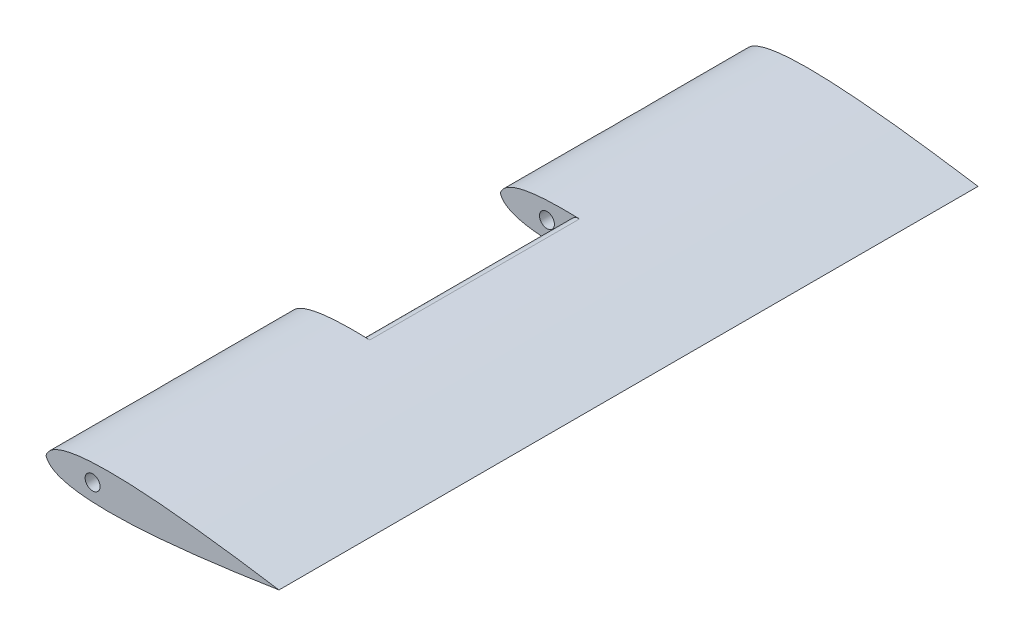
ISO-10303-21;
HEADER;
FILE_DESCRIPTION(('STEP AP214'),'2;1');
FILE_NAME('part.step','',(''),(''),'','','');
FILE_SCHEMA(('AUTOMOTIVE_DESIGN { 1 0 10303 214 1 1 1 1 }'));
ENDSEC;
DATA;
#1=APPLICATION_CONTEXT('core data for automotive mechanical design processes');
#2=APPLICATION_PROTOCOL_DEFINITION('international standard','automotive_design',2000,#1);
#3=PRODUCT_CONTEXT('',#1,'mechanical');
#4=PRODUCT('Part','Part','',(#3));
#5=PRODUCT_RELATED_PRODUCT_CATEGORY('part','',(#4));
#6=PRODUCT_DEFINITION_FORMATION('','',#4);
#7=PRODUCT_DEFINITION_CONTEXT('part definition',#1,'design');
#8=PRODUCT_DEFINITION('design','',#6,#7);
#9=PRODUCT_DEFINITION_SHAPE('','',#8);
#10=(LENGTH_UNIT() NAMED_UNIT(*) SI_UNIT(.MILLI.,.METRE.));
#11=(NAMED_UNIT(*) PLANE_ANGLE_UNIT() SI_UNIT($,.RADIAN.));
#12=(NAMED_UNIT(*) SI_UNIT($,.STERADIAN.) SOLID_ANGLE_UNIT());
#13=UNCERTAINTY_MEASURE_WITH_UNIT(LENGTH_MEASURE(1.E-05),#10,'distance_accuracy_value','');
#14=(GEOMETRIC_REPRESENTATION_CONTEXT(3) GLOBAL_UNCERTAINTY_ASSIGNED_CONTEXT((#13)) GLOBAL_UNIT_ASSIGNED_CONTEXT((#10,
#11,#12)) REPRESENTATION_CONTEXT('',''));
#15=CARTESIAN_POINT('',(0.,0.,0.));
#16=DIRECTION('',(0.,0.,1.));
#17=DIRECTION('',(1.,0.,0.));
#18=AXIS2_PLACEMENT_3D('',#15,#16,#17);
#19=CARTESIAN_POINT('',(-96.3888888888889,0.,75.));
#20=CARTESIAN_POINT('',(-94.2178519249729,7.51357712199036,75.));
#21=CARTESIAN_POINT('',(-46.3888888888889,0.,75.));
#22=B_SPLINE_CURVE_WITH_KNOTS('',2,(#19,#20,#21),.UNSPECIFIED.,.F.,.F.,(3,3),(0.,1.),.UNSPECIFIED.);
#23=DIRECTION('',(0.,0.,-1.));
#24=VECTOR('',#23,1.);
#25=SURFACE_OF_LINEAR_EXTRUSION('',#22,#24);
#26=DIRECTION('',(0.,0.,-1.));
#27=VECTOR('',#26,1.);
#28=CARTESIAN_POINT('',(-79.404655713445,3.69483376264788,-22.5));
#29=LINE('',#28,#27);
#30=CARTESIAN_POINT('',(-79.404655713445,3.69483376264787,-22.5));
#31=VERTEX_POINT('',#30);
#32=CARTESIAN_POINT('',(-79.404655713445,3.69483376264788,22.5));
#33=VERTEX_POINT('',#32);
#34=EDGE_CURVE('E115',#31,#33,#29,.F.);
#35=ORIENTED_EDGE('',*,*,#34,.T.);
#36=CARTESIAN_POINT('',(-96.3888888888889,0.,22.5));
#37=CARTESIAN_POINT('',(-94.2178519249729,7.51357712199036,22.5));
#38=CARTESIAN_POINT('',(-46.3888888888889,0.,22.5));
#39=B_SPLINE_CURVE_WITH_KNOTS('',2,(#36,#37,#38),.UNSPECIFIED.,.F.,.F.,(3,3),(0.,1.),.UNSPECIFIED.);
#40=CARTESIAN_POINT('',(-96.3888888888889,0.,22.5));
#41=VERTEX_POINT('',#40);
#42=EDGE_CURVE('E57',#33,#41,#39,.F.);
#43=ORIENTED_EDGE('',*,*,#42,.T.);
#44=DIRECTION('',(0.,0.,-1.));
#45=VECTOR('',#44,1.);
#46=CARTESIAN_POINT('',(-96.3888888888889,0.,75.));
#47=LINE('',#46,#45);
#48=CARTESIAN_POINT('',(-96.3888888888889,0.,75.));
#49=VERTEX_POINT('',#48);
#50=EDGE_CURVE('E112',#49,#41,#47,.T.);
#51=ORIENTED_EDGE('',*,*,#50,.F.);
#52=CARTESIAN_POINT('',(-46.3888888888889,0.,75.));
#53=VERTEX_POINT('',#52);
#54=EDGE_CURVE('E224',#49,#53,#22,.T.);
#55=ORIENTED_EDGE('',*,*,#54,.T.);
#56=DIRECTION('',(0.,0.,-1.));
#57=VECTOR('',#56,1.);
#58=CARTESIAN_POINT('',(-46.3888888888889,0.,75.));
#59=LINE('',#58,#57);
#60=CARTESIAN_POINT('',(-46.3888888888889,0.,-75.));
#61=VERTEX_POINT('',#60);
#62=EDGE_CURVE('E131',#53,#61,#59,.T.);
#63=ORIENTED_EDGE('',*,*,#62,.T.);
#64=CARTESIAN_POINT('',(-96.3888888888889,0.,-75.));
#65=CARTESIAN_POINT('',(-94.2178519249729,7.51357712199036,-75.));
#66=CARTESIAN_POINT('',(-46.3888888888889,0.,-75.));
#67=B_SPLINE_CURVE_WITH_KNOTS('',2,(#64,#65,#66),.UNSPECIFIED.,.F.,.F.,(3,3),(0.,1.),.UNSPECIFIED.);
#68=CARTESIAN_POINT('',(-96.3888888888889,0.,-75.));
#69=VERTEX_POINT('',#68);
#70=EDGE_CURVE('E202',#69,#61,#67,.T.);
#71=ORIENTED_EDGE('',*,*,#70,.F.);
#72=CARTESIAN_POINT('',(-96.3888888888889,0.,-22.5));
#73=VERTEX_POINT('',#72);
#74=EDGE_CURVE('E125',#73,#69,#47,.T.);
#75=ORIENTED_EDGE('',*,*,#74,.F.);
#76=CARTESIAN_POINT('',(-96.3888888888889,0.,-22.5));
#77=CARTESIAN_POINT('',(-94.2178519249729,7.51357712199036,-22.5));
#78=CARTESIAN_POINT('',(-46.3888888888889,0.,-22.5));
#79=B_SPLINE_CURVE_WITH_KNOTS('',2,(#76,#77,#78),.UNSPECIFIED.,.F.,.F.,(3,3),(0.,1.),.UNSPECIFIED.);
#80=EDGE_CURVE('E65',#31,#73,#79,.F.);
#81=ORIENTED_EDGE('',*,*,#80,.F.);
#82=EDGE_LOOP('',(#35,#43,#51,#55,#63,#71,#75,#81));
#83=FACE_BOUND('',#82,.T.);
#84=ADVANCED_FACE('F41',(#83),#25,.T.);
#85=CARTESIAN_POINT('',(-86.3888888888889,0.,75.));
#86=DIRECTION('',(0.,0.,-1.));
#87=DIRECTION('',(-1.,0.,0.));
#88=AXIS2_PLACEMENT_3D('',#85,#86,#87);
#89=CYLINDRICAL_SURFACE('',#88,1.60000000000001);
#90=CARTESIAN_POINT('',(-86.3888888888889,0.,75.));
#91=DIRECTION('',(0.,0.,1.));
#92=DIRECTION('',(1.,0.,0.));
#93=AXIS2_PLACEMENT_3D('',#90,#91,#92);
#94=CIRCLE('',#93,1.60000000000001);
#95=CARTESIAN_POINT('',(-84.7888888888889,0.,75.));
#96=VERTEX_POINT('',#95);
#97=EDGE_CURVE('E217',#96,#96,#94,.T.);
#98=ORIENTED_EDGE('',*,*,#97,.T.);
#99=EDGE_LOOP('',(#98));
#100=FACE_BOUND('',#99,.T.);
#101=CARTESIAN_POINT('',(-86.3888888888889,0.,22.5));
#102=DIRECTION('',(0.,0.,-1.));
#103=DIRECTION('',(-1.,0.,0.));
#104=AXIS2_PLACEMENT_3D('',#101,#102,#103);
#105=CIRCLE('',#104,1.60000000000001);
#106=CARTESIAN_POINT('',(-87.9888888888889,0.,22.5));
#107=VERTEX_POINT('',#106);
#108=EDGE_CURVE('E117',#107,#107,#105,.T.);
#109=ORIENTED_EDGE('',*,*,#108,.T.);
#110=EDGE_LOOP('',(#109));
#111=FACE_BOUND('',#110,.T.);
#112=ADVANCED_FACE('F239',(#100,#111),#89,.F.);
#113=CARTESIAN_POINT('',(-96.3888888888889,0.,75.));
#114=CARTESIAN_POINT('',(-94.2178519249729,-7.51357712199036,75.));
#115=CARTESIAN_POINT('',(-46.3888888888889,0.,75.));
#116=B_SPLINE_CURVE_WITH_KNOTS('',2,(#113,#114,#115),.UNSPECIFIED.,.F.,.F.,(3,3),(0.,1.),.UNSPECIFIED.);
#117=DIRECTION('',(0.,0.,-1.));
#118=VECTOR('',#117,1.);
#119=SURFACE_OF_LINEAR_EXTRUSION('',#116,#118);
#120=CARTESIAN_POINT('',(-96.3888888888889,0.,22.5));
#121=CARTESIAN_POINT('',(-94.2178519249729,-7.51357712199036,22.5));
#122=CARTESIAN_POINT('',(-46.3888888888889,0.,22.5));
#123=B_SPLINE_CURVE_WITH_KNOTS('',2,(#120,#121,#122),.UNSPECIFIED.,.F.,.F.,(3,3),(0.,1.),.UNSPECIFIED.);
#124=CARTESIAN_POINT('',(-79.404655713445,-3.69483376264788,22.5));
#125=VERTEX_POINT('',#124);
#126=EDGE_CURVE('E99',#125,#41,#123,.F.);
#127=ORIENTED_EDGE('',*,*,#126,.F.);
#128=DIRECTION('',(0.,0.,-1.));
#129=VECTOR('',#128,1.);
#130=CARTESIAN_POINT('',(-79.404655713445,-3.69483376264788,22.5));
#131=LINE('',#130,#129);
#132=CARTESIAN_POINT('',(-79.404655713445,-3.69483376264788,-22.5));
#133=VERTEX_POINT('',#132);
#134=EDGE_CURVE('E151',#125,#133,#131,.T.);
#135=ORIENTED_EDGE('',*,*,#134,.T.);
#136=CARTESIAN_POINT('',(-96.3888888888889,0.,-22.5));
#137=CARTESIAN_POINT('',(-94.2178519249729,-7.51357712199036,-22.5));
#138=CARTESIAN_POINT('',(-46.3888888888889,0.,-22.5));
#139=B_SPLINE_CURVE_WITH_KNOTS('',2,(#136,#137,#138),.UNSPECIFIED.,.F.,.F.,(3,3),(0.,1.),.UNSPECIFIED.);
#140=EDGE_CURVE('E109',#133,#73,#139,.F.);
#141=ORIENTED_EDGE('',*,*,#140,.T.);
#142=ORIENTED_EDGE('',*,*,#74,.T.);
#143=CARTESIAN_POINT('',(-96.3888888888889,0.,-75.));
#144=CARTESIAN_POINT('',(-94.2178519249729,-7.51357712199036,-75.));
#145=CARTESIAN_POINT('',(-46.3888888888889,0.,-75.));
#146=B_SPLINE_CURVE_WITH_KNOTS('',2,(#143,#144,#145),.UNSPECIFIED.,.F.,.F.,(3,3),(0.,1.),.UNSPECIFIED.);
#147=EDGE_CURVE('E208',#69,#61,#146,.T.);
#148=ORIENTED_EDGE('',*,*,#147,.T.);
#149=ORIENTED_EDGE('',*,*,#62,.F.);
#150=EDGE_CURVE('E122',#49,#53,#116,.T.);
#151=ORIENTED_EDGE('',*,*,#150,.F.);
#152=ORIENTED_EDGE('',*,*,#50,.T.);
#153=EDGE_LOOP('',(#127,#135,#141,#142,#148,#149,#151,#152));
#154=FACE_BOUND('',#153,.T.);
#155=ADVANCED_FACE('F120',(#154),#119,.F.);
#156=CARTESIAN_POINT('',(-86.3888888888889,0.,-22.5));
#157=DIRECTION('',(0.,0.,-1.));
#158=DIRECTION('',(-1.,0.,0.));
#159=AXIS2_PLACEMENT_3D('',#156,#157,#158);
#160=CIRCLE('',#159,1.60000000000001);
#161=CARTESIAN_POINT('',(-87.9888888888889,0.,-22.5));
#162=VERTEX_POINT('',#161);
#163=EDGE_CURVE('E118',#162,#162,#160,.T.);
#164=ORIENTED_EDGE('',*,*,#163,.F.);
#165=EDGE_LOOP('',(#164));
#166=FACE_BOUND('',#165,.T.);
#167=CARTESIAN_POINT('',(-86.3888888888889,0.,-75.));
#168=DIRECTION('',(0.,0.,1.));
#169=DIRECTION('',(1.,0.,0.));
#170=AXIS2_PLACEMENT_3D('',#167,#168,#169);
#171=CIRCLE('',#170,1.60000000000001);
#172=CARTESIAN_POINT('',(-84.7888888888889,0.,-75.));
#173=VERTEX_POINT('',#172);
#174=EDGE_CURVE('E198',#173,#173,#171,.T.);
#175=ORIENTED_EDGE('',*,*,#174,.F.);
#176=EDGE_LOOP('',(#175));
#177=FACE_BOUND('',#176,.T.);
#178=ADVANCED_FACE('F241',(#166,#177),#89,.F.);
#179=CARTESIAN_POINT('',(0.,0.,75.));
#180=DIRECTION('',(0.,0.,1.));
#181=DIRECTION('',(1.,0.,0.));
#182=AXIS2_PLACEMENT_3D('',#179,#180,#181);
#183=PLANE('',#182);
#184=ORIENTED_EDGE('',*,*,#97,.F.);
#185=EDGE_LOOP('',(#184));
#186=FACE_BOUND('',#185,.T.);
#187=ORIENTED_EDGE('',*,*,#54,.F.);
#188=ORIENTED_EDGE('',*,*,#150,.T.);
#189=EDGE_LOOP('',(#187,#188));
#190=FACE_BOUND('',#189,.T.);
#191=ADVANCED_FACE('F243',(#186,#190),#183,.T.);
#192=CARTESIAN_POINT('',(0.,0.,-75.));
#193=DIRECTION('',(0.,0.,1.));
#194=DIRECTION('',(1.,0.,0.));
#195=AXIS2_PLACEMENT_3D('',#192,#193,#194);
#196=PLANE('',#195);
#197=ORIENTED_EDGE('',*,*,#174,.T.);
#198=EDGE_LOOP('',(#197));
#199=FACE_BOUND('',#198,.T.);
#200=ORIENTED_EDGE('',*,*,#70,.T.);
#201=ORIENTED_EDGE('',*,*,#147,.F.);
#202=EDGE_LOOP('',(#200,#201));
#203=FACE_BOUND('',#202,.T.);
#204=ADVANCED_FACE('F257',(#199,#203),#196,.F.);
#205=CARTESIAN_POINT('',(0.,0.,22.5));
#206=DIRECTION('',(0.,0.,-1.));
#207=DIRECTION('',(-1.,0.,0.));
#208=AXIS2_PLACEMENT_3D('',#205,#206,#207);
#209=PLANE('',#208);
#210=ORIENTED_EDGE('',*,*,#108,.F.);
#211=EDGE_LOOP('',(#210));
#212=FACE_BOUND('',#211,.T.);
#213=ORIENTED_EDGE('',*,*,#42,.F.);
#214=CARTESIAN_POINT('',(-79.4737035294121,1.69602601823868,22.5));
#215=DIRECTION('',(0.,0.,-1.));
#216=DIRECTION('',(-1.,0.,0.));
#217=AXIS2_PLACEMENT_3D('',#214,#215,#216);
#218=CIRCLE('',#217,2.);
#219=CARTESIAN_POINT('',(-81.4637253364094,1.49649354550472,22.5));
#220=VERTEX_POINT('',#219);
#221=EDGE_CURVE('E50',#33,#220,#218,.F.);
#222=ORIENTED_EDGE('',*,*,#221,.T.);
#223=CARTESIAN_POINT('',(-96.3888888888889,0.,22.5));
#224=DIRECTION('',(0.,0.,-1.));
#225=DIRECTION('',(-1.,0.,0.));
#226=AXIS2_PLACEMENT_3D('',#223,#224,#225);
#227=CIRCLE('',#226,15.);
#228=CARTESIAN_POINT('',(-81.4637253364094,-1.49649354550472,22.5));
#229=VERTEX_POINT('',#228);
#230=EDGE_CURVE('E162',#220,#229,#227,.T.);
#231=ORIENTED_EDGE('',*,*,#230,.T.);
#232=CARTESIAN_POINT('',(-79.4737035294121,-1.69602601823868,22.5));
#233=DIRECTION('',(0.,0.,-1.));
#234=DIRECTION('',(-1.,0.,0.));
#235=AXIS2_PLACEMENT_3D('',#232,#233,#234);
#236=CIRCLE('',#235,2.);
#237=EDGE_CURVE('E102',#229,#125,#236,.F.);
#238=ORIENTED_EDGE('',*,*,#237,.T.);
#239=ORIENTED_EDGE('',*,*,#126,.T.);
#240=EDGE_LOOP('',(#213,#222,#231,#238,#239));
#241=FACE_BOUND('',#240,.T.);
#242=ADVANCED_FACE('F100',(#212,#241),#209,.T.);
#243=CARTESIAN_POINT('',(-96.3888888888889,0.,-75.));
#244=DIRECTION('',(0.,0.,-1.));
#245=DIRECTION('',(-1.,0.,0.));
#246=AXIS2_PLACEMENT_3D('',#243,#244,#245);
#247=CYLINDRICAL_SURFACE('',#246,15.);
#248=CARTESIAN_POINT('',(-96.3888888888889,0.,-22.5));
#249=DIRECTION('',(0.,0.,-1.));
#250=DIRECTION('',(-1.,0.,0.));
#251=AXIS2_PLACEMENT_3D('',#248,#249,#250);
#252=CIRCLE('',#251,15.);
#253=CARTESIAN_POINT('',(-81.4637253364094,1.49649354550472,-22.5));
#254=VERTEX_POINT('',#253);
#255=CARTESIAN_POINT('',(-81.4637253364094,-1.49649354550472,-22.5));
#256=VERTEX_POINT('',#255);
#257=EDGE_CURVE('E171',#254,#256,#252,.T.);
#258=ORIENTED_EDGE('',*,*,#257,.T.);
#259=DIRECTION('',(0.,0.,-1.));
#260=VECTOR('',#259,1.);
#261=CARTESIAN_POINT('',(-81.4637253364094,-1.49649354550472,-75.));
#262=LINE('',#261,#260);
#263=EDGE_CURVE('E147',#256,#229,#262,.F.);
#264=ORIENTED_EDGE('',*,*,#263,.T.);
#265=ORIENTED_EDGE('',*,*,#230,.F.);
#266=DIRECTION('',(0.,0.,-1.));
#267=VECTOR('',#266,1.);
#268=CARTESIAN_POINT('',(-81.4637253364094,1.49649354550472,-75.));
#269=LINE('',#268,#267);
#270=EDGE_CURVE('E108',#220,#254,#269,.T.);
#271=ORIENTED_EDGE('',*,*,#270,.T.);
#272=EDGE_LOOP('',(#258,#264,#265,#271));
#273=FACE_BOUND('',#272,.T.);
#274=ADVANCED_FACE('F167',(#273),#247,.F.);
#275=CARTESIAN_POINT('',(0.,0.,-22.5));
#276=DIRECTION('',(0.,0.,-1.));
#277=DIRECTION('',(-1.,0.,0.));
#278=AXIS2_PLACEMENT_3D('',#275,#276,#277);
#279=PLANE('',#278);
#280=ORIENTED_EDGE('',*,*,#163,.T.);
#281=EDGE_LOOP('',(#280));
#282=FACE_BOUND('',#281,.T.);
#283=ORIENTED_EDGE('',*,*,#80,.T.);
#284=ORIENTED_EDGE('',*,*,#140,.F.);
#285=CARTESIAN_POINT('',(-79.4737035294121,-1.69602601823868,-22.5));
#286=DIRECTION('',(0.,0.,-1.));
#287=DIRECTION('',(-1.,0.,0.));
#288=AXIS2_PLACEMENT_3D('',#285,#286,#287);
#289=CIRCLE('',#288,2.);
#290=EDGE_CURVE('E158',#133,#256,#289,.T.);
#291=ORIENTED_EDGE('',*,*,#290,.T.);
#292=ORIENTED_EDGE('',*,*,#257,.F.);
#293=CARTESIAN_POINT('',(-79.4737035294121,1.69602601823868,-22.5));
#294=DIRECTION('',(0.,0.,-1.));
#295=DIRECTION('',(-1.,0.,0.));
#296=AXIS2_PLACEMENT_3D('',#293,#294,#295);
#297=CIRCLE('',#296,2.);
#298=EDGE_CURVE('E11',#254,#31,#297,.T.);
#299=ORIENTED_EDGE('',*,*,#298,.T.);
#300=EDGE_LOOP('',(#283,#284,#291,#292,#299));
#301=FACE_BOUND('',#300,.T.);
#302=ADVANCED_FACE('F175',(#282,#301),#279,.F.);
#303=CARTESIAN_POINT('',(-79.4737035294121,-1.69602601823868,0.));
#304=DIRECTION('',(0.,0.,-1.));
#305=DIRECTION('',(-1.,0.,0.));
#306=AXIS2_PLACEMENT_3D('',#303,#304,#305);
#307=CYLINDRICAL_SURFACE('',#306,2.);
#308=ORIENTED_EDGE('',*,*,#290,.F.);
#309=ORIENTED_EDGE('',*,*,#134,.F.);
#310=ORIENTED_EDGE('',*,*,#237,.F.);
#311=ORIENTED_EDGE('',*,*,#263,.F.);
#312=EDGE_LOOP('',(#308,#309,#310,#311));
#313=FACE_BOUND('',#312,.T.);
#314=ADVANCED_FACE('F245',(#313),#307,.T.);
#315=CARTESIAN_POINT('',(-79.4737035294121,1.69602601823868,0.));
#316=DIRECTION('',(0.,0.,-1.));
#317=DIRECTION('',(-1.,0.,0.));
#318=AXIS2_PLACEMENT_3D('',#315,#316,#317);
#319=CYLINDRICAL_SURFACE('',#318,2.);
#320=ORIENTED_EDGE('',*,*,#298,.F.);
#321=ORIENTED_EDGE('',*,*,#270,.F.);
#322=ORIENTED_EDGE('',*,*,#221,.F.);
#323=ORIENTED_EDGE('',*,*,#34,.F.);
#324=EDGE_LOOP('',(#320,#321,#322,#323));
#325=FACE_BOUND('',#324,.T.);
#326=ADVANCED_FACE('F43',(#325),#319,.T.);
#327=CLOSED_SHELL('',(#84,#112,#155,#178,#191,#204,#242,#274,#302,#314,#326));
#328=MANIFOLD_SOLID_BREP('B2',#327);
#329=ADVANCED_BREP_SHAPE_REPRESENTATION('',(#18,#328),#14);
#330=SHAPE_DEFINITION_REPRESENTATION(#9,#329);
ENDSEC;
END-ISO-10303-21;
